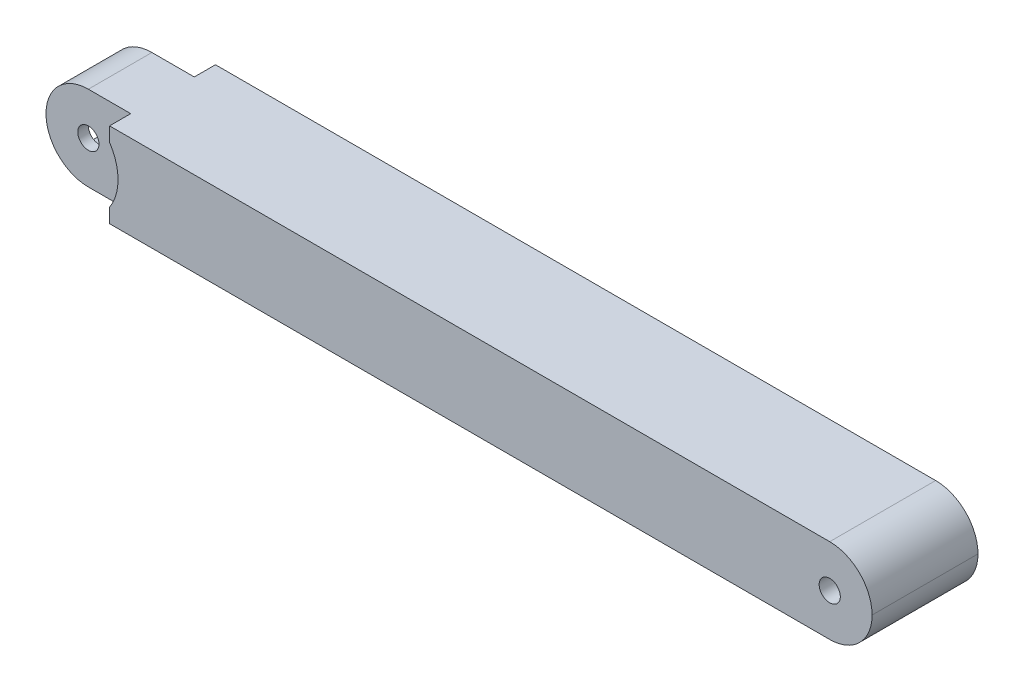
ISO-10303-21;
HEADER;
FILE_DESCRIPTION(('STEP AP214'),'2;1');
FILE_NAME('part.step','',(''),(''),'','','');
FILE_SCHEMA(('AUTOMOTIVE_DESIGN { 1 0 10303 214 1 1 1 1 }'));
ENDSEC;
DATA;
#1=APPLICATION_CONTEXT('core data for automotive mechanical design processes');
#2=APPLICATION_PROTOCOL_DEFINITION('international standard','automotive_design',2000,#1);
#3=PRODUCT_CONTEXT('',#1,'mechanical');
#4=PRODUCT('Part','Part','',(#3));
#5=PRODUCT_RELATED_PRODUCT_CATEGORY('part','',(#4));
#6=PRODUCT_DEFINITION_FORMATION('','',#4);
#7=PRODUCT_DEFINITION_CONTEXT('part definition',#1,'design');
#8=PRODUCT_DEFINITION('design','',#6,#7);
#9=PRODUCT_DEFINITION_SHAPE('','',#8);
#10=(LENGTH_UNIT() NAMED_UNIT(*) SI_UNIT(.MILLI.,.METRE.));
#11=(NAMED_UNIT(*) PLANE_ANGLE_UNIT() SI_UNIT($,.RADIAN.));
#12=(NAMED_UNIT(*) SI_UNIT($,.STERADIAN.) SOLID_ANGLE_UNIT());
#13=UNCERTAINTY_MEASURE_WITH_UNIT(LENGTH_MEASURE(1.E-05),#10,'distance_accuracy_value','');
#14=(GEOMETRIC_REPRESENTATION_CONTEXT(3) GLOBAL_UNCERTAINTY_ASSIGNED_CONTEXT((#13)) GLOBAL_UNIT_ASSIGNED_CONTEXT((#10,
#11,#12)) REPRESENTATION_CONTEXT('',''));
#15=CARTESIAN_POINT('',(0.,0.,0.));
#16=DIRECTION('',(0.,0.,1.));
#17=DIRECTION('',(1.,0.,0.));
#18=AXIS2_PLACEMENT_3D('',#15,#16,#17);
#19=CARTESIAN_POINT('',(-195.,30.,-15.));
#20=DIRECTION('',(1.,0.,0.));
#21=DIRECTION('',(0.,0.,-1.));
#22=AXIS2_PLACEMENT_3D('',#19,#20,#21);
#23=PLANE('',#22);
#24=DIRECTION('',(0.,-1.,0.));
#25=VECTOR('',#24,1.);
#26=CARTESIAN_POINT('',(-195.,30.,7.5));
#27=LINE('',#26,#25);
#28=CARTESIAN_POINT('',(-195.,30.,7.5));
#29=VERTEX_POINT('',#28);
#30=CARTESIAN_POINT('',(-195.,10.,7.50000000000001));
#31=VERTEX_POINT('',#30);
#32=EDGE_CURVE('E246',#29,#31,#27,.T.);
#33=ORIENTED_EDGE('',*,*,#32,.F.);
#34=DIRECTION('',(0.,0.,1.));
#35=VECTOR('',#34,1.);
#36=CARTESIAN_POINT('',(-195.,30.,-15.));
#37=LINE('',#36,#35);
#38=CARTESIAN_POINT('',(-195.,30.,10.));
#39=VERTEX_POINT('',#38);
#40=EDGE_CURVE('E365',#29,#39,#37,.T.);
#41=ORIENTED_EDGE('',*,*,#40,.T.);
#42=DIRECTION('',(0.,-1.,0.));
#43=VECTOR('',#42,1.);
#44=CARTESIAN_POINT('',(-195.,30.,10.));
#45=LINE('',#44,#43);
#46=CARTESIAN_POINT('',(-195.,10.,10.));
#47=VERTEX_POINT('',#46);
#48=EDGE_CURVE('E390',#39,#47,#45,.T.);
#49=ORIENTED_EDGE('',*,*,#48,.T.);
#50=DIRECTION('',(0.,0.,1.));
#51=VECTOR('',#50,1.);
#52=CARTESIAN_POINT('',(-195.,10.,-15.));
#53=LINE('',#52,#51);
#54=EDGE_CURVE('E380',#31,#47,#53,.T.);
#55=ORIENTED_EDGE('',*,*,#54,.F.);
#56=EDGE_LOOP('',(#33,#41,#49,#55));
#57=FACE_BOUND('',#56,.T.);
#58=ADVANCED_FACE('F38',(#57),#23,.T.);
#59=CARTESIAN_POINT('',(-160.,40.,25.));
#60=DIRECTION('',(1.,0.,0.));
#61=DIRECTION('',(0.,0.,-1.));
#62=AXIS2_PLACEMENT_3D('',#59,#60,#61);
#63=PLANE('',#62);
#64=DIRECTION('',(0.,0.,1.));
#65=VECTOR('',#64,1.);
#66=CARTESIAN_POINT('',(-160.,33.2664991614218,15.));
#67=LINE('',#66,#65);
#68=CARTESIAN_POINT('',(-160.,33.2664991614218,25.));
#69=VERTEX_POINT('',#68);
#70=CARTESIAN_POINT('',(-160.,33.2664991614218,15.));
#71=VERTEX_POINT('',#70);
#72=EDGE_CURVE('E277',#69,#71,#67,.F.);
#73=ORIENTED_EDGE('',*,*,#72,.F.);
#74=DIRECTION('',(0.,-1.,0.));
#75=VECTOR('',#74,1.);
#76=CARTESIAN_POINT('',(-160.,40.,25.));
#77=LINE('',#76,#75);
#78=CARTESIAN_POINT('',(-160.,40.,25.));
#79=VERTEX_POINT('',#78);
#80=EDGE_CURVE('E332',#79,#69,#77,.T.);
#81=ORIENTED_EDGE('',*,*,#80,.F.);
#82=DIRECTION('',(0.,0.,-1.));
#83=VECTOR('',#82,1.);
#84=CARTESIAN_POINT('',(-160.,40.,25.));
#85=LINE('',#84,#83);
#86=CARTESIAN_POINT('',(-160.,40.,15.));
#87=VERTEX_POINT('',#86);
#88=EDGE_CURVE('E344',#79,#87,#85,.T.);
#89=ORIENTED_EDGE('',*,*,#88,.T.);
#90=DIRECTION('',(0.,-1.,0.));
#91=VECTOR('',#90,1.);
#92=CARTESIAN_POINT('',(-160.,40.,15.));
#93=LINE('',#92,#91);
#94=EDGE_CURVE('E345',#87,#71,#93,.T.);
#95=ORIENTED_EDGE('',*,*,#94,.T.);
#96=EDGE_LOOP('',(#73,#81,#89,#95));
#97=FACE_BOUND('',#96,.T.);
#98=ADVANCED_FACE('F541',(#97),#63,.F.);
#99=DIRECTION('',(0.,0.,1.));
#100=VECTOR('',#99,1.);
#101=CARTESIAN_POINT('',(-160.,6.73350083857872,15.));
#102=LINE('',#101,#100);
#103=CARTESIAN_POINT('',(-160.,6.73350083857872,15.));
#104=VERTEX_POINT('',#103);
#105=CARTESIAN_POINT('',(-160.,6.73350083857872,25.));
#106=VERTEX_POINT('',#105);
#107=EDGE_CURVE('E274',#104,#106,#102,.T.);
#108=ORIENTED_EDGE('',*,*,#107,.F.);
#109=CARTESIAN_POINT('',(-160.,0.,15.));
#110=VERTEX_POINT('',#109);
#111=EDGE_CURVE('E331',#104,#110,#93,.T.);
#112=ORIENTED_EDGE('',*,*,#111,.T.);
#113=DIRECTION('',(0.,0.,-1.));
#114=VECTOR('',#113,1.);
#115=CARTESIAN_POINT('',(-160.,0.,25.));
#116=LINE('',#115,#114);
#117=CARTESIAN_POINT('',(-160.,0.,25.));
#118=VERTEX_POINT('',#117);
#119=EDGE_CURVE('E352',#118,#110,#116,.T.);
#120=ORIENTED_EDGE('',*,*,#119,.F.);
#121=EDGE_CURVE('E337',#106,#118,#77,.T.);
#122=ORIENTED_EDGE('',*,*,#121,.F.);
#123=EDGE_LOOP('',(#108,#112,#120,#122));
#124=FACE_BOUND('',#123,.T.);
#125=ADVANCED_FACE('F547',(#124),#63,.F.);
#126=CARTESIAN_POINT('',(-160.,40.,-25.));
#127=DIRECTION('',(1.,0.,0.));
#128=DIRECTION('',(0.,1.,0.));
#129=AXIS2_PLACEMENT_3D('',#126,#127,#128);
#130=PLANE('',#129);
#131=DIRECTION('',(0.,1.,0.));
#132=VECTOR('',#131,1.);
#133=CARTESIAN_POINT('',(-160.,40.,-15.));
#134=LINE('',#133,#132);
#135=CARTESIAN_POINT('',(-160.,0.,-15.));
#136=VERTEX_POINT('',#135);
#137=CARTESIAN_POINT('',(-160.,6.73350083857868,-15.));
#138=VERTEX_POINT('',#137);
#139=EDGE_CURVE('E310',#136,#138,#134,.T.);
#140=ORIENTED_EDGE('',*,*,#139,.T.);
#141=DIRECTION('',(0.,0.,-1.));
#142=VECTOR('',#141,1.);
#143=CARTESIAN_POINT('',(-160.,6.73350083857866,-15.));
#144=LINE('',#143,#142);
#145=CARTESIAN_POINT('',(-160.,6.73350083857867,-25.));
#146=VERTEX_POINT('',#145);
#147=EDGE_CURVE('E288',#138,#146,#144,.T.);
#148=ORIENTED_EDGE('',*,*,#147,.T.);
#149=DIRECTION('',(0.,1.,0.));
#150=VECTOR('',#149,1.);
#151=CARTESIAN_POINT('',(-160.,40.,-25.));
#152=LINE('',#151,#150);
#153=CARTESIAN_POINT('',(-160.,0.,-25.));
#154=VERTEX_POINT('',#153);
#155=EDGE_CURVE('E311',#154,#146,#152,.T.);
#156=ORIENTED_EDGE('',*,*,#155,.F.);
#157=DIRECTION('',(0.,0.,1.));
#158=VECTOR('',#157,1.);
#159=CARTESIAN_POINT('',(-160.,0.,-25.));
#160=LINE('',#159,#158);
#161=EDGE_CURVE('E327',#154,#136,#160,.T.);
#162=ORIENTED_EDGE('',*,*,#161,.T.);
#163=EDGE_LOOP('',(#140,#148,#156,#162));
#164=FACE_BOUND('',#163,.T.);
#165=ADVANCED_FACE('F569',(#164),#130,.F.);
#166=CARTESIAN_POINT('',(-200.,40.,-15.));
#167=DIRECTION('',(0.,0.,1.));
#168=DIRECTION('',(1.,0.,0.));
#169=AXIS2_PLACEMENT_3D('',#166,#167,#168);
#170=PLANE('',#169);
#171=DIRECTION('',(-1.,0.,0.));
#172=VECTOR('',#171,1.);
#173=CARTESIAN_POINT('',(-200.,0.,-15.));
#174=LINE('',#173,#172);
#175=CARTESIAN_POINT('',(-180.,0.,-15.));
#176=VERTEX_POINT('',#175);
#177=EDGE_CURVE('E402',#136,#176,#174,.T.);
#178=ORIENTED_EDGE('',*,*,#177,.T.);
#179=CARTESIAN_POINT('',(-180.,20.,-15.));
#180=DIRECTION('',(0.,0.,1.));
#181=DIRECTION('',(1.,0.,0.));
#182=AXIS2_PLACEMENT_3D('',#179,#180,#181);
#183=CIRCLE('',#182,20.);
#184=CARTESIAN_POINT('',(-200.,20.,-15.));
#185=VERTEX_POINT('',#184);
#186=EDGE_CURVE('E450',#176,#185,#183,.F.);
#187=ORIENTED_EDGE('',*,*,#186,.T.);
#188=CARTESIAN_POINT('',(-180.,20.,-15.));
#189=DIRECTION('',(0.,0.,1.));
#190=DIRECTION('',(1.,0.,0.));
#191=AXIS2_PLACEMENT_3D('',#188,#189,#190);
#192=CIRCLE('',#191,20.);
#193=CARTESIAN_POINT('',(-180.,40.,-15.));
#194=VERTEX_POINT('',#193);
#195=EDGE_CURVE('E446',#185,#194,#192,.F.);
#196=ORIENTED_EDGE('',*,*,#195,.T.);
#197=DIRECTION('',(-1.,0.,0.));
#198=VECTOR('',#197,1.);
#199=CARTESIAN_POINT('',(-200.,40.,-15.));
#200=LINE('',#199,#198);
#201=CARTESIAN_POINT('',(-160.,40.,-15.));
#202=VERTEX_POINT('',#201);
#203=EDGE_CURVE('E403',#202,#194,#200,.T.);
#204=ORIENTED_EDGE('',*,*,#203,.F.);
#205=CARTESIAN_POINT('',(-160.,33.2664991614218,-15.));
#206=VERTEX_POINT('',#205);
#207=EDGE_CURVE('E323',#206,#202,#134,.T.);
#208=ORIENTED_EDGE('',*,*,#207,.F.);
#209=CARTESIAN_POINT('',(-180.,20.0000000000002,-15.));
#210=DIRECTION('',(0.,0.,-1.));
#211=DIRECTION('',(1.,0.,0.));
#212=AXIS2_PLACEMENT_3D('',#209,#210,#211);
#213=CIRCLE('',#212,24.);
#214=EDGE_CURVE('E280',#206,#138,#213,.T.);
#215=ORIENTED_EDGE('',*,*,#214,.T.);
#216=ORIENTED_EDGE('',*,*,#139,.F.);
#217=EDGE_LOOP('',(#178,#187,#196,#204,#208,#215,#216));
#218=FACE_BOUND('',#217,.T.);
#219=CARTESIAN_POINT('',(-180.,20.,-15.));
#220=DIRECTION('',(0.,0.,-1.));
#221=DIRECTION('',(1.,0.,0.));
#222=AXIS2_PLACEMENT_3D('',#219,#220,#221);
#223=CIRCLE('',#222,5.00000000000002);
#224=CARTESIAN_POINT('',(-175.,20.,-15.));
#225=VERTEX_POINT('',#224);
#226=EDGE_CURVE('E292',#225,#225,#223,.T.);
#227=ORIENTED_EDGE('',*,*,#226,.F.);
#228=EDGE_LOOP('',(#227));
#229=FACE_BOUND('',#228,.T.);
#230=ADVANCED_FACE('F719',(#218,#229),#170,.F.);
#231=CARTESIAN_POINT('',(-200.,40.,15.));
#232=DIRECTION('',(0.,0.,-1.));
#233=DIRECTION('',(-1.,0.,0.));
#234=AXIS2_PLACEMENT_3D('',#231,#232,#233);
#235=PLANE('',#234);
#236=ORIENTED_EDGE('',*,*,#94,.F.);
#237=DIRECTION('',(1.,0.,0.));
#238=VECTOR('',#237,1.);
#239=CARTESIAN_POINT('',(-200.,40.,15.));
#240=LINE('',#239,#238);
#241=CARTESIAN_POINT('',(-180.,40.,15.));
#242=VERTEX_POINT('',#241);
#243=EDGE_CURVE('E406',#242,#87,#240,.T.);
#244=ORIENTED_EDGE('',*,*,#243,.F.);
#245=CARTESIAN_POINT('',(-180.,20.,15.));
#246=DIRECTION('',(0.,0.,-1.));
#247=DIRECTION('',(-1.,0.,0.));
#248=AXIS2_PLACEMENT_3D('',#245,#246,#247);
#249=CIRCLE('',#248,20.);
#250=CARTESIAN_POINT('',(-200.,20.,15.));
#251=VERTEX_POINT('',#250);
#252=EDGE_CURVE('E440',#242,#251,#249,.F.);
#253=ORIENTED_EDGE('',*,*,#252,.T.);
#254=CARTESIAN_POINT('',(-180.,20.,15.));
#255=DIRECTION('',(0.,0.,-1.));
#256=DIRECTION('',(-1.,0.,0.));
#257=AXIS2_PLACEMENT_3D('',#254,#255,#256);
#258=CIRCLE('',#257,20.);
#259=CARTESIAN_POINT('',(-180.,0.,15.));
#260=VERTEX_POINT('',#259);
#261=EDGE_CURVE('E443',#251,#260,#258,.F.);
#262=ORIENTED_EDGE('',*,*,#261,.T.);
#263=DIRECTION('',(1.,0.,0.));
#264=VECTOR('',#263,1.);
#265=CARTESIAN_POINT('',(-200.,0.,15.));
#266=LINE('',#265,#264);
#267=EDGE_CURVE('E407',#260,#110,#266,.T.);
#268=ORIENTED_EDGE('',*,*,#267,.T.);
#269=ORIENTED_EDGE('',*,*,#111,.F.);
#270=CARTESIAN_POINT('',(-180.,20.0000000000002,15.));
#271=DIRECTION('',(0.,0.,-1.));
#272=DIRECTION('',(1.,0.,0.));
#273=AXIS2_PLACEMENT_3D('',#270,#271,#272);
#274=CIRCLE('',#273,24.);
#275=EDGE_CURVE('E271',#71,#104,#274,.T.);
#276=ORIENTED_EDGE('',*,*,#275,.F.);
#277=EDGE_LOOP('',(#236,#244,#253,#262,#268,#269,#276));
#278=FACE_BOUND('',#277,.T.);
#279=CARTESIAN_POINT('',(-180.,20.,15.));
#280=DIRECTION('',(0.,0.,-1.));
#281=DIRECTION('',(-1.,0.,0.));
#282=AXIS2_PLACEMENT_3D('',#279,#280,#281);
#283=CIRCLE('',#282,5.00000000000002);
#284=CARTESIAN_POINT('',(-185.,20.,15.));
#285=VERTEX_POINT('',#284);
#286=EDGE_CURVE('E301',#285,#285,#283,.T.);
#287=ORIENTED_EDGE('',*,*,#286,.T.);
#288=EDGE_LOOP('',(#287));
#289=FACE_BOUND('',#288,.T.);
#290=ADVANCED_FACE('F711',(#278,#289),#235,.F.);
#291=CARTESIAN_POINT('',(0.,40.,0.));
#292=DIRECTION('',(0.,1.,0.));
#293=DIRECTION('',(0.,0.,1.));
#294=AXIS2_PLACEMENT_3D('',#291,#292,#293);
#295=PLANE('',#294);
#296=DIRECTION('',(-1.,0.,0.));
#297=VECTOR('',#296,1.);
#298=CARTESIAN_POINT('',(-160.,40.,25.));
#299=LINE('',#298,#297);
#300=CARTESIAN_POINT('',(180.,40.,25.));
#301=VERTEX_POINT('',#300);
#302=EDGE_CURVE('E341',#301,#79,#299,.T.);
#303=ORIENTED_EDGE('',*,*,#302,.F.);
#304=DIRECTION('',(0.,0.,-1.));
#305=VECTOR('',#304,1.);
#306=CARTESIAN_POINT('',(180.,40.,-25.));
#307=LINE('',#306,#305);
#308=CARTESIAN_POINT('',(180.,40.,-25.));
#309=VERTEX_POINT('',#308);
#310=EDGE_CURVE('E437',#301,#309,#307,.T.);
#311=ORIENTED_EDGE('',*,*,#310,.T.);
#312=DIRECTION('',(1.,0.,0.));
#313=VECTOR('',#312,1.);
#314=CARTESIAN_POINT('',(200.,40.,-25.));
#315=LINE('',#314,#313);
#316=CARTESIAN_POINT('',(-160.,40.,-25.));
#317=VERTEX_POINT('',#316);
#318=EDGE_CURVE('E315',#317,#309,#315,.T.);
#319=ORIENTED_EDGE('',*,*,#318,.F.);
#320=DIRECTION('',(0.,0.,1.));
#321=VECTOR('',#320,1.);
#322=CARTESIAN_POINT('',(-160.,40.,-25.));
#323=LINE('',#322,#321);
#324=EDGE_CURVE('E319',#317,#202,#323,.T.);
#325=ORIENTED_EDGE('',*,*,#324,.T.);
#326=ORIENTED_EDGE('',*,*,#203,.T.);
#327=DIRECTION('',(0.,0.,1.));
#328=VECTOR('',#327,1.);
#329=CARTESIAN_POINT('',(-180.,40.,15.));
#330=LINE('',#329,#328);
#331=EDGE_CURVE('E434',#194,#242,#330,.T.);
#332=ORIENTED_EDGE('',*,*,#331,.T.);
#333=ORIENTED_EDGE('',*,*,#243,.T.);
#334=ORIENTED_EDGE('',*,*,#88,.F.);
#335=EDGE_LOOP('',(#303,#311,#319,#325,#326,#332,#333,#334));
#336=FACE_BOUND('',#335,.T.);
#337=ADVANCED_FACE('F703',(#336),#295,.T.);
#338=CARTESIAN_POINT('',(0.,0.,0.));
#339=DIRECTION('',(0.,1.,0.));
#340=DIRECTION('',(0.,0.,1.));
#341=AXIS2_PLACEMENT_3D('',#338,#339,#340);
#342=PLANE('',#341);
#343=DIRECTION('',(-1.,0.,0.));
#344=VECTOR('',#343,1.);
#345=CARTESIAN_POINT('',(200.,0.,-25.));
#346=LINE('',#345,#344);
#347=CARTESIAN_POINT('',(180.,0.,-25.));
#348=VERTEX_POINT('',#347);
#349=EDGE_CURVE('E306',#348,#154,#346,.T.);
#350=ORIENTED_EDGE('',*,*,#349,.F.);
#351=DIRECTION('',(0.,0.,-1.));
#352=VECTOR('',#351,1.);
#353=CARTESIAN_POINT('',(180.,0.,0.));
#354=LINE('',#353,#352);
#355=CARTESIAN_POINT('',(180.,0.,25.));
#356=VERTEX_POINT('',#355);
#357=EDGE_CURVE('E424',#348,#356,#354,.F.);
#358=ORIENTED_EDGE('',*,*,#357,.T.);
#359=DIRECTION('',(1.,0.,0.));
#360=VECTOR('',#359,1.);
#361=CARTESIAN_POINT('',(-160.,0.,25.));
#362=LINE('',#361,#360);
#363=EDGE_CURVE('E336',#118,#356,#362,.T.);
#364=ORIENTED_EDGE('',*,*,#363,.F.);
#365=ORIENTED_EDGE('',*,*,#119,.T.);
#366=ORIENTED_EDGE('',*,*,#267,.F.);
#367=DIRECTION('',(0.,0.,1.));
#368=VECTOR('',#367,1.);
#369=CARTESIAN_POINT('',(-180.,0.,0.));
#370=LINE('',#369,#368);
#371=EDGE_CURVE('E420',#260,#176,#370,.F.);
#372=ORIENTED_EDGE('',*,*,#371,.T.);
#373=ORIENTED_EDGE('',*,*,#177,.F.);
#374=ORIENTED_EDGE('',*,*,#161,.F.);
#375=EDGE_LOOP('',(#350,#358,#364,#365,#366,#372,#373,#374));
#376=FACE_BOUND('',#375,.T.);
#377=ADVANCED_FACE('F563',(#376),#342,.F.);
#378=CARTESIAN_POINT('',(0.,0.,25.));
#379=DIRECTION('',(0.,0.,1.));
#380=DIRECTION('',(1.,0.,0.));
#381=AXIS2_PLACEMENT_3D('',#378,#379,#380);
#382=PLANE('',#381);
#383=CARTESIAN_POINT('',(180.,20.,25.));
#384=DIRECTION('',(0.,0.,1.));
#385=DIRECTION('',(1.,0.,0.));
#386=AXIS2_PLACEMENT_3D('',#383,#384,#385);
#387=CIRCLE('',#386,5.00000000000002);
#388=CARTESIAN_POINT('',(185.,20.,25.));
#389=VERTEX_POINT('',#388);
#390=EDGE_CURVE('E258',#389,#389,#387,.T.);
#391=ORIENTED_EDGE('',*,*,#390,.F.);
#392=EDGE_LOOP('',(#391));
#393=FACE_BOUND('',#392,.T.);
#394=ORIENTED_EDGE('',*,*,#80,.T.);
#395=CARTESIAN_POINT('',(-180.,20.0000000000002,25.));
#396=DIRECTION('',(0.,0.,1.));
#397=DIRECTION('',(1.,0.,0.));
#398=AXIS2_PLACEMENT_3D('',#395,#396,#397);
#399=CIRCLE('',#398,24.);
#400=EDGE_CURVE('E468',#69,#106,#399,.F.);
#401=ORIENTED_EDGE('',*,*,#400,.T.);
#402=ORIENTED_EDGE('',*,*,#121,.T.);
#403=ORIENTED_EDGE('',*,*,#363,.T.);
#404=CARTESIAN_POINT('',(180.,20.,25.));
#405=DIRECTION('',(0.,0.,1.));
#406=DIRECTION('',(1.,0.,0.));
#407=AXIS2_PLACEMENT_3D('',#404,#405,#406);
#408=CIRCLE('',#407,20.);
#409=CARTESIAN_POINT('',(200.,20.,25.));
#410=VERTEX_POINT('',#409);
#411=EDGE_CURVE('E431',#356,#410,#408,.T.);
#412=ORIENTED_EDGE('',*,*,#411,.T.);
#413=CARTESIAN_POINT('',(180.,20.,25.));
#414=DIRECTION('',(0.,0.,1.));
#415=DIRECTION('',(1.,0.,0.));
#416=AXIS2_PLACEMENT_3D('',#413,#414,#415);
#417=CIRCLE('',#416,20.);
#418=EDGE_CURVE('E428',#410,#301,#417,.T.);
#419=ORIENTED_EDGE('',*,*,#418,.T.);
#420=ORIENTED_EDGE('',*,*,#302,.T.);
#421=EDGE_LOOP('',(#394,#401,#402,#403,#412,#419,#420));
#422=FACE_BOUND('',#421,.T.);
#423=ADVANCED_FACE('F559',(#393,#422),#382,.T.);
#424=CARTESIAN_POINT('',(-160.,33.2664991614218,-25.));
#425=VERTEX_POINT('',#424);
#426=EDGE_CURVE('E309',#425,#317,#152,.T.);
#427=ORIENTED_EDGE('',*,*,#426,.F.);
#428=DIRECTION('',(0.,0.,-1.));
#429=VECTOR('',#428,1.);
#430=CARTESIAN_POINT('',(-160.,33.2664991614218,-15.));
#431=LINE('',#430,#429);
#432=EDGE_CURVE('E284',#425,#206,#431,.F.);
#433=ORIENTED_EDGE('',*,*,#432,.T.);
#434=ORIENTED_EDGE('',*,*,#207,.T.);
#435=ORIENTED_EDGE('',*,*,#324,.F.);
#436=EDGE_LOOP('',(#427,#433,#434,#435));
#437=FACE_BOUND('',#436,.T.);
#438=ADVANCED_FACE('F562',(#437),#130,.F.);
#439=CARTESIAN_POINT('',(0.,0.,-25.));
#440=DIRECTION('',(0.,0.,-1.));
#441=DIRECTION('',(-1.,0.,0.));
#442=AXIS2_PLACEMENT_3D('',#439,#440,#441);
#443=PLANE('',#442);
#444=CARTESIAN_POINT('',(180.,20.,-25.));
#445=DIRECTION('',(0.,0.,1.));
#446=DIRECTION('',(1.,0.,0.));
#447=AXIS2_PLACEMENT_3D('',#444,#445,#446);
#448=CIRCLE('',#447,5.00000000000002);
#449=CARTESIAN_POINT('',(185.,20.,-25.));
#450=VERTEX_POINT('',#449);
#451=EDGE_CURVE('E259',#450,#450,#448,.T.);
#452=ORIENTED_EDGE('',*,*,#451,.T.);
#453=EDGE_LOOP('',(#452));
#454=FACE_BOUND('',#453,.T.);
#455=CARTESIAN_POINT('',(-180.,20.0000000000002,-25.));
#456=DIRECTION('',(0.,0.,-1.));
#457=DIRECTION('',(-1.,0.,0.));
#458=AXIS2_PLACEMENT_3D('',#455,#456,#457);
#459=CIRCLE('',#458,24.);
#460=EDGE_CURVE('E454',#425,#146,#459,.T.);
#461=ORIENTED_EDGE('',*,*,#460,.F.);
#462=ORIENTED_EDGE('',*,*,#426,.T.);
#463=ORIENTED_EDGE('',*,*,#318,.T.);
#464=CARTESIAN_POINT('',(180.,20.,-25.));
#465=DIRECTION('',(0.,0.,-1.));
#466=DIRECTION('',(-1.,0.,0.));
#467=AXIS2_PLACEMENT_3D('',#464,#465,#466);
#468=CIRCLE('',#467,20.);
#469=CARTESIAN_POINT('',(200.,20.,-25.));
#470=VERTEX_POINT('',#469);
#471=EDGE_CURVE('E410',#309,#470,#468,.T.);
#472=ORIENTED_EDGE('',*,*,#471,.T.);
#473=CARTESIAN_POINT('',(180.,20.,-25.));
#474=DIRECTION('',(0.,0.,-1.));
#475=DIRECTION('',(-1.,0.,0.));
#476=AXIS2_PLACEMENT_3D('',#473,#474,#475);
#477=CIRCLE('',#476,20.);
#478=EDGE_CURVE('E417',#470,#348,#477,.T.);
#479=ORIENTED_EDGE('',*,*,#478,.T.);
#480=ORIENTED_EDGE('',*,*,#349,.T.);
#481=ORIENTED_EDGE('',*,*,#155,.T.);
#482=EDGE_LOOP('',(#461,#462,#463,#472,#479,#480,#481));
#483=FACE_BOUND('',#482,.T.);
#484=ADVANCED_FACE('F567',(#454,#483),#443,.T.);
#485=CARTESIAN_POINT('',(180.,20.,0.));
#486=DIRECTION('',(0.,0.,1.));
#487=DIRECTION('',(1.,0.,0.));
#488=AXIS2_PLACEMENT_3D('',#485,#486,#487);
#489=CYLINDRICAL_SURFACE('',#488,20.);
#490=ORIENTED_EDGE('',*,*,#310,.F.);
#491=ORIENTED_EDGE('',*,*,#418,.F.);
#492=DIRECTION('',(0.,0.,-1.));
#493=VECTOR('',#492,1.);
#494=CARTESIAN_POINT('',(200.,20.,25.));
#495=LINE('',#494,#493);
#496=EDGE_CURVE('E455',#470,#410,#495,.F.);
#497=ORIENTED_EDGE('',*,*,#496,.F.);
#498=ORIENTED_EDGE('',*,*,#471,.F.);
#499=EDGE_LOOP('',(#490,#491,#497,#498));
#500=FACE_BOUND('',#499,.T.);
#501=ADVANCED_FACE('F572',(#500),#489,.T.);
#502=CARTESIAN_POINT('',(180.,20.,-15.));
#503=DIRECTION('',(0.,0.,-1.));
#504=DIRECTION('',(-1.,0.,0.));
#505=AXIS2_PLACEMENT_3D('',#502,#503,#504);
#506=CYLINDRICAL_SURFACE('',#505,20.);
#507=ORIENTED_EDGE('',*,*,#411,.F.);
#508=ORIENTED_EDGE('',*,*,#357,.F.);
#509=ORIENTED_EDGE('',*,*,#478,.F.);
#510=ORIENTED_EDGE('',*,*,#496,.T.);
#511=EDGE_LOOP('',(#507,#508,#509,#510));
#512=FACE_BOUND('',#511,.T.);
#513=ADVANCED_FACE('F668',(#512),#506,.T.);
#514=CARTESIAN_POINT('',(-180.,20.,0.));
#515=DIRECTION('',(0.,0.,-1.));
#516=DIRECTION('',(-1.,0.,0.));
#517=AXIS2_PLACEMENT_3D('',#514,#515,#516);
#518=CYLINDRICAL_SURFACE('',#517,20.);
#519=CARTESIAN_POINT('',(-180.,20.,7.5));
#520=DIRECTION('',(0.,0.,1.));
#521=DIRECTION('',(0.,-1.,0.));
#522=AXIS2_PLACEMENT_3D('',#519,#520,#521);
#523=CIRCLE('',#522,20.);
#524=CARTESIAN_POINT('',(-200.,20.,7.5));
#525=VERTEX_POINT('',#524);
#526=CARTESIAN_POINT('',(-197.320508075689,30.,7.5));
#527=VERTEX_POINT('',#526);
#528=EDGE_CURVE('E252',#525,#527,#523,.F.);
#529=ORIENTED_EDGE('',*,*,#528,.F.);
#530=DIRECTION('',(0.,0.,1.));
#531=VECTOR('',#530,1.);
#532=CARTESIAN_POINT('',(-200.,20.,-15.));
#533=LINE('',#532,#531);
#534=EDGE_CURVE('E459',#251,#525,#533,.F.);
#535=ORIENTED_EDGE('',*,*,#534,.F.);
#536=ORIENTED_EDGE('',*,*,#252,.F.);
#537=ORIENTED_EDGE('',*,*,#331,.F.);
#538=ORIENTED_EDGE('',*,*,#195,.F.);
#539=CARTESIAN_POINT('',(-200.,20.,-7.5));
#540=VERTEX_POINT('',#539);
#541=EDGE_CURVE('E305',#540,#185,#533,.F.);
#542=ORIENTED_EDGE('',*,*,#541,.F.);
#543=CARTESIAN_POINT('',(-180.,20.,-7.5));
#544=DIRECTION('',(0.,0.,-1.));
#545=DIRECTION('',(0.,1.,0.));
#546=AXIS2_PLACEMENT_3D('',#543,#544,#545);
#547=CIRCLE('',#546,20.);
#548=CARTESIAN_POINT('',(-197.320508075689,30.,-7.5));
#549=VERTEX_POINT('',#548);
#550=EDGE_CURVE('E54',#549,#540,#547,.F.);
#551=ORIENTED_EDGE('',*,*,#550,.F.);
#552=DIRECTION('',(0.,0.,-1.));
#553=VECTOR('',#552,1.);
#554=CARTESIAN_POINT('',(-197.320508075689,30.,0.));
#555=LINE('',#554,#553);
#556=EDGE_CURVE('E255',#527,#549,#555,.T.);
#557=ORIENTED_EDGE('',*,*,#556,.F.);
#558=EDGE_LOOP('',(#529,#535,#536,#537,#538,#542,#551,#557));
#559=FACE_BOUND('',#558,.T.);
#560=ADVANCED_FACE('F40',(#559),#518,.T.);
#561=CARTESIAN_POINT('',(-180.,20.,-15.));
#562=DIRECTION('',(0.,0.,1.));
#563=DIRECTION('',(1.,0.,0.));
#564=AXIS2_PLACEMENT_3D('',#561,#562,#563);
#565=CYLINDRICAL_SURFACE('',#564,20.);
#566=CARTESIAN_POINT('',(-180.,20.,7.50000000000001));
#567=DIRECTION('',(0.,0.,1.));
#568=DIRECTION('',(0.,-1.,0.));
#569=AXIS2_PLACEMENT_3D('',#566,#567,#568);
#570=CIRCLE('',#569,20.);
#571=CARTESIAN_POINT('',(-193.228756555323,5.,7.50000000000001));
#572=VERTEX_POINT('',#571);
#573=EDGE_CURVE('E249',#572,#525,#570,.F.);
#574=ORIENTED_EDGE('',*,*,#573,.F.);
#575=DIRECTION('',(0.,0.,1.));
#576=VECTOR('',#575,1.);
#577=CARTESIAN_POINT('',(-193.228756555323,5.,-15.));
#578=LINE('',#577,#576);
#579=CARTESIAN_POINT('',(-193.228756555323,5.,-7.49999999999999));
#580=VERTEX_POINT('',#579);
#581=EDGE_CURVE('E11',#580,#572,#578,.T.);
#582=ORIENTED_EDGE('',*,*,#581,.F.);
#583=CARTESIAN_POINT('',(-180.,20.,-7.5));
#584=DIRECTION('',(0.,0.,-1.));
#585=DIRECTION('',(0.,1.,0.));
#586=AXIS2_PLACEMENT_3D('',#583,#584,#585);
#587=CIRCLE('',#586,20.);
#588=EDGE_CURVE('E218',#540,#580,#587,.F.);
#589=ORIENTED_EDGE('',*,*,#588,.F.);
#590=ORIENTED_EDGE('',*,*,#541,.T.);
#591=ORIENTED_EDGE('',*,*,#186,.F.);
#592=ORIENTED_EDGE('',*,*,#371,.F.);
#593=ORIENTED_EDGE('',*,*,#261,.F.);
#594=ORIENTED_EDGE('',*,*,#534,.T.);
#595=EDGE_LOOP('',(#574,#582,#589,#590,#591,#592,#593,#594));
#596=FACE_BOUND('',#595,.T.);
#597=ADVANCED_FACE('F577',(#596),#565,.T.);
#598=CARTESIAN_POINT('',(-180.,20.,25.));
#599=DIRECTION('',(0.,0.,-1.));
#600=DIRECTION('',(-1.,0.,0.));
#601=AXIS2_PLACEMENT_3D('',#598,#599,#600);
#602=CYLINDRICAL_SURFACE('',#601,5.00000000000002);
#603=CARTESIAN_POINT('',(-180.,20.,10.));
#604=DIRECTION('',(0.,0.,-1.));
#605=DIRECTION('',(-1.,0.,0.));
#606=AXIS2_PLACEMENT_3D('',#603,#604,#605);
#607=CIRCLE('',#606,5.00000000000002);
#608=CARTESIAN_POINT('',(-185.,20.,10.));
#609=VERTEX_POINT('',#608);
#610=EDGE_CURVE('E296',#609,#609,#607,.T.);
#611=ORIENTED_EDGE('',*,*,#610,.T.);
#612=EDGE_LOOP('',(#611));
#613=FACE_BOUND('',#612,.T.);
#614=ORIENTED_EDGE('',*,*,#286,.F.);
#615=EDGE_LOOP('',(#614));
#616=FACE_BOUND('',#615,.T.);
#617=ADVANCED_FACE('F574',(#613,#616),#602,.F.);
#618=CARTESIAN_POINT('',(-180.,20.,-9.99999999999999));
#619=DIRECTION('',(0.,0.,1.));
#620=DIRECTION('',(1.,0.,0.));
#621=AXIS2_PLACEMENT_3D('',#618,#619,#620);
#622=CIRCLE('',#621,5.00000000000002);
#623=CARTESIAN_POINT('',(-175.,20.,-9.99999999999999));
#624=VERTEX_POINT('',#623);
#625=EDGE_CURVE('E297',#624,#624,#622,.T.);
#626=ORIENTED_EDGE('',*,*,#625,.T.);
#627=EDGE_LOOP('',(#626));
#628=FACE_BOUND('',#627,.T.);
#629=ORIENTED_EDGE('',*,*,#226,.T.);
#630=EDGE_LOOP('',(#629));
#631=FACE_BOUND('',#630,.T.);
#632=ADVANCED_FACE('F536',(#628,#631),#602,.F.);
#633=CARTESIAN_POINT('',(195.,30.,-15.));
#634=DIRECTION('',(-1.,0.,0.));
#635=DIRECTION('',(0.,0.,1.));
#636=AXIS2_PLACEMENT_3D('',#633,#634,#635);
#637=PLANE('',#636);
#638=DIRECTION('',(0.,0.,-1.));
#639=VECTOR('',#638,1.);
#640=CARTESIAN_POINT('',(195.,10.,-15.));
#641=LINE('',#640,#639);
#642=CARTESIAN_POINT('',(195.,10.,10.));
#643=VERTEX_POINT('',#642);
#644=CARTESIAN_POINT('',(195.,10.,-9.99999999999999));
#645=VERTEX_POINT('',#644);
#646=EDGE_CURVE('E356',#643,#645,#641,.T.);
#647=ORIENTED_EDGE('',*,*,#646,.F.);
#648=DIRECTION('',(0.,-1.,0.));
#649=VECTOR('',#648,1.);
#650=CARTESIAN_POINT('',(195.,30.,10.));
#651=LINE('',#650,#649);
#652=CARTESIAN_POINT('',(195.,30.,10.));
#653=VERTEX_POINT('',#652);
#654=EDGE_CURVE('E373',#653,#643,#651,.T.);
#655=ORIENTED_EDGE('',*,*,#654,.F.);
#656=DIRECTION('',(0.,0.,-1.));
#657=VECTOR('',#656,1.);
#658=CARTESIAN_POINT('',(195.,30.,-15.));
#659=LINE('',#658,#657);
#660=CARTESIAN_POINT('',(195.,30.,-9.99999999999999));
#661=VERTEX_POINT('',#660);
#662=EDGE_CURVE('E357',#653,#661,#659,.T.);
#663=ORIENTED_EDGE('',*,*,#662,.T.);
#664=DIRECTION('',(0.,-1.,0.));
#665=VECTOR('',#664,1.);
#666=CARTESIAN_POINT('',(195.,30.,-9.99999999999999));
#667=LINE('',#666,#665);
#668=EDGE_CURVE('E398',#661,#645,#667,.T.);
#669=ORIENTED_EDGE('',*,*,#668,.T.);
#670=EDGE_LOOP('',(#647,#655,#663,#669));
#671=FACE_BOUND('',#670,.T.);
#672=ADVANCED_FACE('F524',(#671),#637,.T.);
#673=CARTESIAN_POINT('',(-200.,30.,-9.99999999999999));
#674=DIRECTION('',(0.,0.,1.));
#675=DIRECTION('',(1.,0.,0.));
#676=AXIS2_PLACEMENT_3D('',#673,#674,#675);
#677=PLANE('',#676);
#678=CARTESIAN_POINT('',(180.,20.,-9.99999999999999));
#679=DIRECTION('',(0.,0.,1.));
#680=DIRECTION('',(1.,0.,0.));
#681=AXIS2_PLACEMENT_3D('',#678,#679,#680);
#682=CIRCLE('',#681,5.00000000000002);
#683=CARTESIAN_POINT('',(185.,20.,-9.99999999999999));
#684=VERTEX_POINT('',#683);
#685=EDGE_CURVE('E267',#684,#684,#682,.T.);
#686=ORIENTED_EDGE('',*,*,#685,.F.);
#687=EDGE_LOOP('',(#686));
#688=FACE_BOUND('',#687,.T.);
#689=ORIENTED_EDGE('',*,*,#625,.F.);
#690=EDGE_LOOP('',(#689));
#691=FACE_BOUND('',#690,.T.);
#692=DIRECTION('',(-1.,0.,0.));
#693=VECTOR('',#692,1.);
#694=CARTESIAN_POINT('',(-200.,10.,-9.99999999999999));
#695=LINE('',#694,#693);
#696=CARTESIAN_POINT('',(-195.,10.,-9.99999999999999));
#697=VERTEX_POINT('',#696);
#698=EDGE_CURVE('E377',#645,#697,#695,.T.);
#699=ORIENTED_EDGE('',*,*,#698,.F.);
#700=ORIENTED_EDGE('',*,*,#668,.F.);
#701=DIRECTION('',(-1.,0.,0.));
#702=VECTOR('',#701,1.);
#703=CARTESIAN_POINT('',(-200.,30.,-9.99999999999999));
#704=LINE('',#703,#702);
#705=CARTESIAN_POINT('',(-195.,30.,-9.99999999999999));
#706=VERTEX_POINT('',#705);
#707=EDGE_CURVE('E361',#661,#706,#704,.T.);
#708=ORIENTED_EDGE('',*,*,#707,.T.);
#709=DIRECTION('',(0.,-1.,0.));
#710=VECTOR('',#709,1.);
#711=CARTESIAN_POINT('',(-195.,30.,-9.99999999999999));
#712=LINE('',#711,#710);
#713=EDGE_CURVE('E394',#706,#697,#712,.T.);
#714=ORIENTED_EDGE('',*,*,#713,.T.);
#715=EDGE_LOOP('',(#699,#700,#708,#714));
#716=FACE_BOUND('',#715,.T.);
#717=ADVANCED_FACE('F526',(#688,#691,#716),#677,.T.);
#718=DIRECTION('',(0.,1.,0.));
#719=VECTOR('',#718,1.);
#720=CARTESIAN_POINT('',(-195.,30.,-7.5));
#721=LINE('',#720,#719);
#722=CARTESIAN_POINT('',(-195.,10.,-7.49999999999999));
#723=VERTEX_POINT('',#722);
#724=CARTESIAN_POINT('',(-195.,30.,-7.5));
#725=VERTEX_POINT('',#724);
#726=EDGE_CURVE('E236',#723,#725,#721,.T.);
#727=ORIENTED_EDGE('',*,*,#726,.F.);
#728=EDGE_CURVE('E381',#697,#723,#53,.T.);
#729=ORIENTED_EDGE('',*,*,#728,.F.);
#730=ORIENTED_EDGE('',*,*,#713,.F.);
#731=EDGE_CURVE('E366',#706,#725,#37,.T.);
#732=ORIENTED_EDGE('',*,*,#731,.T.);
#733=EDGE_LOOP('',(#727,#729,#730,#732));
#734=FACE_BOUND('',#733,.T.);
#735=ADVANCED_FACE('F491',(#734),#23,.T.);
#736=CARTESIAN_POINT('',(-200.,30.,10.));
#737=DIRECTION('',(0.,0.,-1.));
#738=DIRECTION('',(-1.,0.,0.));
#739=AXIS2_PLACEMENT_3D('',#736,#737,#738);
#740=PLANE('',#739);
#741=CARTESIAN_POINT('',(180.,20.,10.));
#742=DIRECTION('',(0.,0.,-1.));
#743=DIRECTION('',(-1.,0.,0.));
#744=AXIS2_PLACEMENT_3D('',#741,#742,#743);
#745=CIRCLE('',#744,5.00000000000002);
#746=CARTESIAN_POINT('',(175.,20.,10.));
#747=VERTEX_POINT('',#746);
#748=EDGE_CURVE('E263',#747,#747,#745,.T.);
#749=ORIENTED_EDGE('',*,*,#748,.F.);
#750=EDGE_LOOP('',(#749));
#751=FACE_BOUND('',#750,.T.);
#752=ORIENTED_EDGE('',*,*,#610,.F.);
#753=EDGE_LOOP('',(#752));
#754=FACE_BOUND('',#753,.T.);
#755=DIRECTION('',(1.,0.,0.));
#756=VECTOR('',#755,1.);
#757=CARTESIAN_POINT('',(-200.,10.,10.));
#758=LINE('',#757,#756);
#759=EDGE_CURVE('E362',#47,#643,#758,.T.);
#760=ORIENTED_EDGE('',*,*,#759,.F.);
#761=ORIENTED_EDGE('',*,*,#48,.F.);
#762=DIRECTION('',(1.,0.,0.));
#763=VECTOR('',#762,1.);
#764=CARTESIAN_POINT('',(-200.,30.,10.));
#765=LINE('',#764,#763);
#766=EDGE_CURVE('E370',#39,#653,#765,.T.);
#767=ORIENTED_EDGE('',*,*,#766,.T.);
#768=ORIENTED_EDGE('',*,*,#654,.T.);
#769=EDGE_LOOP('',(#760,#761,#767,#768));
#770=FACE_BOUND('',#769,.T.);
#771=ADVANCED_FACE('F519',(#751,#754,#770),#740,.T.);
#772=CARTESIAN_POINT('',(0.,30.,0.));
#773=DIRECTION('',(0.,1.,0.));
#774=DIRECTION('',(0.,0.,1.));
#775=AXIS2_PLACEMENT_3D('',#772,#773,#774);
#776=PLANE('',#775);
#777=ORIENTED_EDGE('',*,*,#40,.F.);
#778=DIRECTION('',(-1.,0.,0.));
#779=VECTOR('',#778,1.);
#780=CARTESIAN_POINT('',(180.,30.,7.5));
#781=LINE('',#780,#779);
#782=EDGE_CURVE('E228',#29,#527,#781,.T.);
#783=ORIENTED_EDGE('',*,*,#782,.T.);
#784=ORIENTED_EDGE('',*,*,#556,.T.);
#785=DIRECTION('',(-1.,0.,0.));
#786=VECTOR('',#785,1.);
#787=CARTESIAN_POINT('',(180.,30.,-7.5));
#788=LINE('',#787,#786);
#789=EDGE_CURVE('E223',#725,#549,#788,.T.);
#790=ORIENTED_EDGE('',*,*,#789,.F.);
#791=ORIENTED_EDGE('',*,*,#731,.F.);
#792=ORIENTED_EDGE('',*,*,#707,.F.);
#793=ORIENTED_EDGE('',*,*,#662,.F.);
#794=ORIENTED_EDGE('',*,*,#766,.F.);
#795=EDGE_LOOP('',(#777,#783,#784,#790,#791,#792,#793,#794));
#796=FACE_BOUND('',#795,.T.);
#797=ADVANCED_FACE('F496',(#796),#776,.F.);
#798=CARTESIAN_POINT('',(0.,10.,0.));
#799=DIRECTION('',(0.,1.,0.));
#800=DIRECTION('',(0.,0.,1.));
#801=AXIS2_PLACEMENT_3D('',#798,#799,#800);
#802=PLANE('',#801);
#803=DIRECTION('',(1.,0.,0.));
#804=VECTOR('',#803,1.);
#805=CARTESIAN_POINT('',(0.,10.,7.50000000000001));
#806=LINE('',#805,#804);
#807=CARTESIAN_POINT('',(180.,10.,7.50000000000001));
#808=VERTEX_POINT('',#807);
#809=EDGE_CURVE('E47',#31,#808,#806,.T.);
#810=ORIENTED_EDGE('',*,*,#809,.F.);
#811=ORIENTED_EDGE('',*,*,#54,.T.);
#812=ORIENTED_EDGE('',*,*,#759,.T.);
#813=ORIENTED_EDGE('',*,*,#646,.T.);
#814=ORIENTED_EDGE('',*,*,#698,.T.);
#815=ORIENTED_EDGE('',*,*,#728,.T.);
#816=DIRECTION('',(-1.,0.,0.));
#817=VECTOR('',#816,1.);
#818=CARTESIAN_POINT('',(0.,10.,-7.49999999999999));
#819=LINE('',#818,#817);
#820=CARTESIAN_POINT('',(180.,10.,-7.49999999999999));
#821=VERTEX_POINT('',#820);
#822=EDGE_CURVE('E477',#821,#723,#819,.T.);
#823=ORIENTED_EDGE('',*,*,#822,.F.);
#824=DIRECTION('',(0.,0.,1.));
#825=VECTOR('',#824,1.);
#826=CARTESIAN_POINT('',(180.,10.,0.));
#827=LINE('',#826,#825);
#828=EDGE_CURVE('E211',#821,#808,#827,.T.);
#829=ORIENTED_EDGE('',*,*,#828,.T.);
#830=EDGE_LOOP('',(#810,#811,#812,#813,#814,#815,#823,#829));
#831=FACE_BOUND('',#830,.T.);
#832=ADVANCED_FACE('F486',(#831),#802,.T.);
#833=CARTESIAN_POINT('',(-180.,20.0000000000002,-15.));
#834=DIRECTION('',(0.,0.,-1.));
#835=DIRECTION('',(-1.,0.,0.));
#836=AXIS2_PLACEMENT_3D('',#833,#834,#835);
#837=CYLINDRICAL_SURFACE('',#836,24.);
#838=ORIENTED_EDGE('',*,*,#214,.F.);
#839=ORIENTED_EDGE('',*,*,#432,.F.);
#840=ORIENTED_EDGE('',*,*,#460,.T.);
#841=ORIENTED_EDGE('',*,*,#147,.F.);
#842=EDGE_LOOP('',(#838,#839,#840,#841));
#843=FACE_BOUND('',#842,.T.);
#844=ADVANCED_FACE('F556',(#843),#837,.F.);
#845=CARTESIAN_POINT('',(-180.,20.0000000000002,15.));
#846=DIRECTION('',(0.,0.,1.));
#847=DIRECTION('',(1.,0.,0.));
#848=AXIS2_PLACEMENT_3D('',#845,#846,#847);
#849=CYLINDRICAL_SURFACE('',#848,24.);
#850=ORIENTED_EDGE('',*,*,#72,.T.);
#851=ORIENTED_EDGE('',*,*,#275,.T.);
#852=ORIENTED_EDGE('',*,*,#107,.T.);
#853=ORIENTED_EDGE('',*,*,#400,.F.);
#854=EDGE_LOOP('',(#850,#851,#852,#853));
#855=FACE_BOUND('',#854,.T.);
#856=ADVANCED_FACE('F581',(#855),#849,.F.);
#857=CARTESIAN_POINT('',(180.,20.,-25.));
#858=DIRECTION('',(0.,0.,1.));
#859=DIRECTION('',(1.,0.,0.));
#860=AXIS2_PLACEMENT_3D('',#857,#858,#859);
#861=CYLINDRICAL_SURFACE('',#860,5.00000000000002);
#862=ORIENTED_EDGE('',*,*,#748,.T.);
#863=EDGE_LOOP('',(#862));
#864=FACE_BOUND('',#863,.T.);
#865=ORIENTED_EDGE('',*,*,#390,.T.);
#866=EDGE_LOOP('',(#865));
#867=FACE_BOUND('',#866,.T.);
#868=ADVANCED_FACE('F585',(#864,#867),#861,.F.);
#869=ORIENTED_EDGE('',*,*,#685,.T.);
#870=EDGE_LOOP('',(#869));
#871=FACE_BOUND('',#870,.T.);
#872=ORIENTED_EDGE('',*,*,#451,.F.);
#873=EDGE_LOOP('',(#872));
#874=FACE_BOUND('',#873,.T.);
#875=ADVANCED_FACE('F589',(#871,#874),#861,.F.);
#876=CARTESIAN_POINT('',(180.,30.,7.5));
#877=DIRECTION('',(0.,0.,1.));
#878=DIRECTION('',(0.,-1.,0.));
#879=AXIS2_PLACEMENT_3D('',#876,#877,#878);
#880=PLANE('',#879);
#881=ORIENTED_EDGE('',*,*,#528,.T.);
#882=ORIENTED_EDGE('',*,*,#782,.F.);
#883=ORIENTED_EDGE('',*,*,#32,.T.);
#884=ORIENTED_EDGE('',*,*,#809,.T.);
#885=DIRECTION('',(0.,1.,0.));
#886=VECTOR('',#885,1.);
#887=CARTESIAN_POINT('',(180.,30.,7.5));
#888=LINE('',#887,#886);
#889=CARTESIAN_POINT('',(180.,5.,7.50000000000001));
#890=VERTEX_POINT('',#889);
#891=EDGE_CURVE('E62',#890,#808,#888,.T.);
#892=ORIENTED_EDGE('',*,*,#891,.F.);
#893=DIRECTION('',(-1.,0.,0.));
#894=VECTOR('',#893,1.);
#895=CARTESIAN_POINT('',(180.,5.,7.50000000000001));
#896=LINE('',#895,#894);
#897=EDGE_CURVE('E222',#890,#572,#896,.T.);
#898=ORIENTED_EDGE('',*,*,#897,.T.);
#899=ORIENTED_EDGE('',*,*,#573,.T.);
#900=EDGE_LOOP('',(#881,#882,#883,#884,#892,#898,#899));
#901=FACE_BOUND('',#900,.T.);
#902=ADVANCED_FACE('F482',(#901),#880,.F.);
#903=CARTESIAN_POINT('',(180.,5.,-7.49999999999999));
#904=DIRECTION('',(0.,-1.,0.));
#905=DIRECTION('',(0.,0.,-1.));
#906=AXIS2_PLACEMENT_3D('',#903,#904,#905);
#907=PLANE('',#906);
#908=ORIENTED_EDGE('',*,*,#581,.T.);
#909=ORIENTED_EDGE('',*,*,#897,.F.);
#910=DIRECTION('',(0.,0.,1.));
#911=VECTOR('',#910,1.);
#912=CARTESIAN_POINT('',(180.,5.,-7.49999999999999));
#913=LINE('',#912,#911);
#914=CARTESIAN_POINT('',(180.,5.,-7.49999999999999));
#915=VERTEX_POINT('',#914);
#916=EDGE_CURVE('E209',#915,#890,#913,.T.);
#917=ORIENTED_EDGE('',*,*,#916,.F.);
#918=DIRECTION('',(-1.,0.,0.));
#919=VECTOR('',#918,1.);
#920=CARTESIAN_POINT('',(180.,5.,-7.49999999999999));
#921=LINE('',#920,#919);
#922=EDGE_CURVE('E216',#915,#580,#921,.T.);
#923=ORIENTED_EDGE('',*,*,#922,.T.);
#924=EDGE_LOOP('',(#908,#909,#917,#923));
#925=FACE_BOUND('',#924,.T.);
#926=ADVANCED_FACE('F225',(#925),#907,.F.);
#927=CARTESIAN_POINT('',(180.,30.,-7.5));
#928=DIRECTION('',(0.,0.,-1.));
#929=DIRECTION('',(0.,1.,0.));
#930=AXIS2_PLACEMENT_3D('',#927,#928,#929);
#931=PLANE('',#930);
#932=ORIENTED_EDGE('',*,*,#550,.T.);
#933=ORIENTED_EDGE('',*,*,#588,.T.);
#934=ORIENTED_EDGE('',*,*,#922,.F.);
#935=DIRECTION('',(0.,-1.,0.));
#936=VECTOR('',#935,1.);
#937=CARTESIAN_POINT('',(180.,30.,-7.5));
#938=LINE('',#937,#936);
#939=EDGE_CURVE('E205',#821,#915,#938,.T.);
#940=ORIENTED_EDGE('',*,*,#939,.F.);
#941=ORIENTED_EDGE('',*,*,#822,.T.);
#942=ORIENTED_EDGE('',*,*,#726,.T.);
#943=ORIENTED_EDGE('',*,*,#789,.T.);
#944=EDGE_LOOP('',(#932,#933,#934,#940,#941,#942,#943));
#945=FACE_BOUND('',#944,.T.);
#946=ADVANCED_FACE('F217',(#945),#931,.F.);
#947=CARTESIAN_POINT('',(180.,0.,0.));
#948=DIRECTION('',(-1.,0.,0.));
#949=DIRECTION('',(0.,0.,1.));
#950=AXIS2_PLACEMENT_3D('',#947,#948,#949);
#951=PLANE('',#950);
#952=ORIENTED_EDGE('',*,*,#939,.T.);
#953=ORIENTED_EDGE('',*,*,#916,.T.);
#954=ORIENTED_EDGE('',*,*,#891,.T.);
#955=ORIENTED_EDGE('',*,*,#828,.F.);
#956=EDGE_LOOP('',(#952,#953,#954,#955));
#957=FACE_BOUND('',#956,.T.);
#958=ADVANCED_FACE('F207',(#957),#951,.T.);
#959=CLOSED_SHELL('',(#58,#98,#125,#165,#230,#290,#337,#377,#423,#438,#484,#501,#513,#560,#597,
#617,#632,#672,#717,#735,#771,#797,#832,#844,#856,#868,#875,#902,#926,#946,#958));
#960=MANIFOLD_SOLID_BREP('B2',#959);
#961=ADVANCED_BREP_SHAPE_REPRESENTATION('',(#18,#960),#14);
#962=SHAPE_DEFINITION_REPRESENTATION(#9,#961);
ENDSEC;
END-ISO-10303-21;
